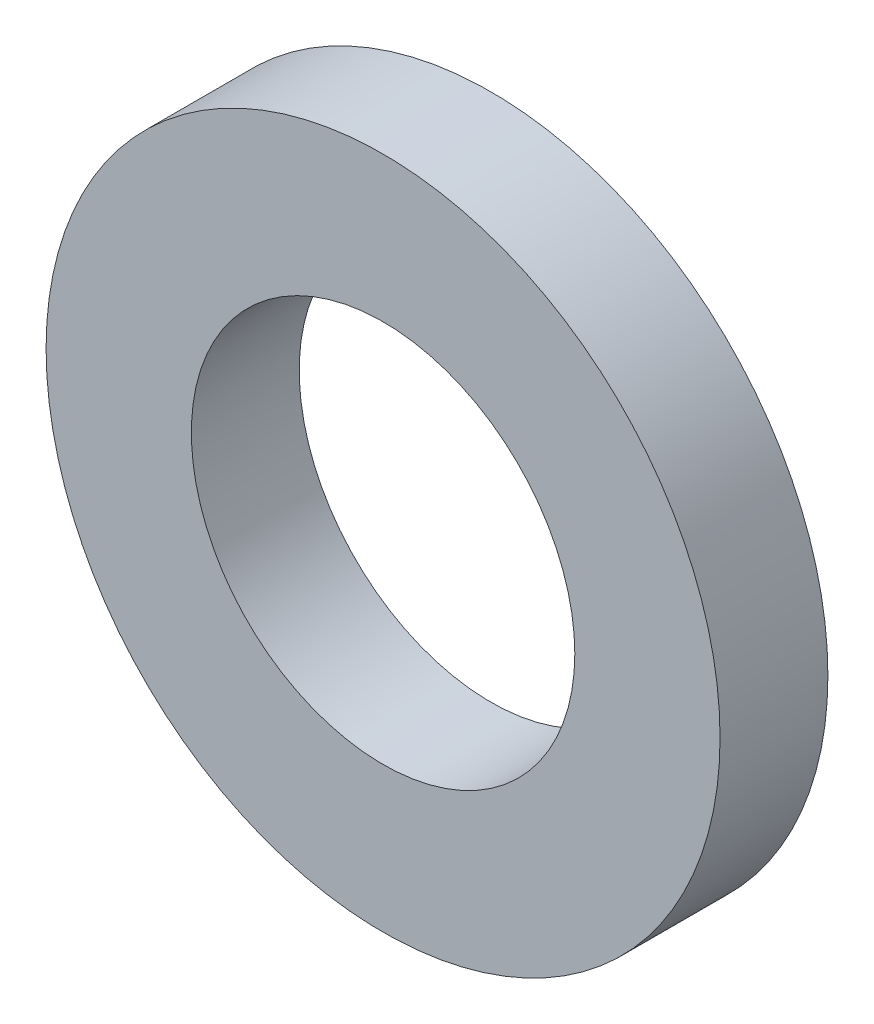
ISO-10303-21;
HEADER;
FILE_DESCRIPTION(('STEP AP214'),'2;1');
FILE_NAME('part.step','',(''),(''),'','','');
FILE_SCHEMA(('AUTOMOTIVE_DESIGN { 1 0 10303 214 1 1 1 1 }'));
ENDSEC;
DATA;
#1=APPLICATION_CONTEXT('core data for automotive mechanical design processes');
#2=APPLICATION_PROTOCOL_DEFINITION('international standard','automotive_design',2000,#1);
#3=PRODUCT_CONTEXT('',#1,'mechanical');
#4=PRODUCT('Part','Part','',(#3));
#5=PRODUCT_RELATED_PRODUCT_CATEGORY('part','',(#4));
#6=PRODUCT_DEFINITION_FORMATION('','',#4);
#7=PRODUCT_DEFINITION_CONTEXT('part definition',#1,'design');
#8=PRODUCT_DEFINITION('design','',#6,#7);
#9=PRODUCT_DEFINITION_SHAPE('','',#8);
#10=(LENGTH_UNIT() NAMED_UNIT(*) SI_UNIT(.MILLI.,.METRE.));
#11=(NAMED_UNIT(*) PLANE_ANGLE_UNIT() SI_UNIT($,.RADIAN.));
#12=(NAMED_UNIT(*) SI_UNIT($,.STERADIAN.) SOLID_ANGLE_UNIT());
#13=UNCERTAINTY_MEASURE_WITH_UNIT(LENGTH_MEASURE(1.E-05),#10,'distance_accuracy_value','');
#14=(GEOMETRIC_REPRESENTATION_CONTEXT(3) GLOBAL_UNCERTAINTY_ASSIGNED_CONTEXT((#13)) GLOBAL_UNIT_ASSIGNED_CONTEXT((#10,
#11,#12)) REPRESENTATION_CONTEXT('',''));
#15=CARTESIAN_POINT('',(0.,0.,0.));
#16=DIRECTION('',(0.,0.,1.));
#17=DIRECTION('',(1.,0.,0.));
#18=AXIS2_PLACEMENT_3D('',#15,#16,#17);
#19=CARTESIAN_POINT('',(0.,0.,1.));
#20=DIRECTION('',(0.,0.,1.));
#21=DIRECTION('',(1.,0.,0.));
#22=AXIS2_PLACEMENT_3D('',#19,#20,#21);
#23=PLANE('',#22);
#24=CARTESIAN_POINT('',(0.,0.,1.));
#25=DIRECTION('',(0.,0.,1.));
#26=DIRECTION('',(1.,0.,0.));
#27=AXIS2_PLACEMENT_3D('',#24,#25,#26);
#28=CIRCLE('',#27,3.125);
#29=CARTESIAN_POINT('',(3.125,0.,1.));
#30=VERTEX_POINT('',#29);
#31=EDGE_CURVE('E10',#30,#30,#28,.T.);
#32=ORIENTED_EDGE('',*,*,#31,.T.);
#33=EDGE_LOOP('',(#32));
#34=FACE_BOUND('',#33,.T.);
#35=CARTESIAN_POINT('',(0.,0.,1.));
#36=DIRECTION('',(0.,0.,1.));
#37=DIRECTION('',(1.,0.,0.));
#38=AXIS2_PLACEMENT_3D('',#35,#36,#37);
#39=CIRCLE('',#38,1.778);
#40=CARTESIAN_POINT('',(1.778,0.,1.));
#41=VERTEX_POINT('',#40);
#42=EDGE_CURVE('E42',#41,#41,#39,.T.);
#43=ORIENTED_EDGE('',*,*,#42,.F.);
#44=EDGE_LOOP('',(#43));
#45=FACE_BOUND('',#44,.T.);
#46=ADVANCED_FACE('F31',(#34,#45),#23,.T.);
#47=CARTESIAN_POINT('',(0.,0.,0.));
#48=DIRECTION('',(0.,0.,1.));
#49=DIRECTION('',(1.,0.,0.));
#50=AXIS2_PLACEMENT_3D('',#47,#48,#49);
#51=PLANE('',#50);
#52=CARTESIAN_POINT('',(0.,0.,0.));
#53=DIRECTION('',(0.,0.,1.));
#54=DIRECTION('',(1.,0.,0.));
#55=AXIS2_PLACEMENT_3D('',#52,#53,#54);
#56=CIRCLE('',#55,3.125);
#57=CARTESIAN_POINT('',(3.125,0.,0.));
#58=VERTEX_POINT('',#57);
#59=EDGE_CURVE('E35',#58,#58,#56,.T.);
#60=ORIENTED_EDGE('',*,*,#59,.F.);
#61=EDGE_LOOP('',(#60));
#62=FACE_BOUND('',#61,.T.);
#63=CARTESIAN_POINT('',(0.,0.,0.));
#64=DIRECTION('',(0.,0.,1.));
#65=DIRECTION('',(1.,0.,0.));
#66=AXIS2_PLACEMENT_3D('',#63,#64,#65);
#67=CIRCLE('',#66,1.778);
#68=CARTESIAN_POINT('',(1.778,0.,0.));
#69=VERTEX_POINT('',#68);
#70=EDGE_CURVE('E44',#69,#69,#67,.T.);
#71=ORIENTED_EDGE('',*,*,#70,.T.);
#72=EDGE_LOOP('',(#71));
#73=FACE_BOUND('',#72,.T.);
#74=ADVANCED_FACE('F54',(#62,#73),#51,.F.);
#75=CARTESIAN_POINT('',(0.,0.,1.));
#76=DIRECTION('',(0.,0.,-1.));
#77=DIRECTION('',(-1.,0.,0.));
#78=AXIS2_PLACEMENT_3D('',#75,#76,#77);
#79=CYLINDRICAL_SURFACE('',#78,3.125);
#80=ORIENTED_EDGE('',*,*,#31,.F.);
#81=EDGE_LOOP('',(#80));
#82=FACE_BOUND('',#81,.T.);
#83=ORIENTED_EDGE('',*,*,#59,.T.);
#84=EDGE_LOOP('',(#83));
#85=FACE_BOUND('',#84,.T.);
#86=ADVANCED_FACE('F33',(#82,#85),#79,.T.);
#87=CARTESIAN_POINT('',(0.,0.,1.));
#88=DIRECTION('',(0.,0.,-1.));
#89=DIRECTION('',(-1.,0.,0.));
#90=AXIS2_PLACEMENT_3D('',#87,#88,#89);
#91=CYLINDRICAL_SURFACE('',#90,1.778);
#92=ORIENTED_EDGE('',*,*,#42,.T.);
#93=EDGE_LOOP('',(#92));
#94=FACE_BOUND('',#93,.T.);
#95=ORIENTED_EDGE('',*,*,#70,.F.);
#96=EDGE_LOOP('',(#95));
#97=FACE_BOUND('',#96,.T.);
#98=ADVANCED_FACE('F50',(#94,#97),#91,.F.);
#99=CLOSED_SHELL('',(#46,#74,#86,#98));
#100=MANIFOLD_SOLID_BREP('B2',#99);
#101=ADVANCED_BREP_SHAPE_REPRESENTATION('',(#18,#100),#14);
#102=SHAPE_DEFINITION_REPRESENTATION(#9,#101);
ENDSEC;
END-ISO-10303-21;
